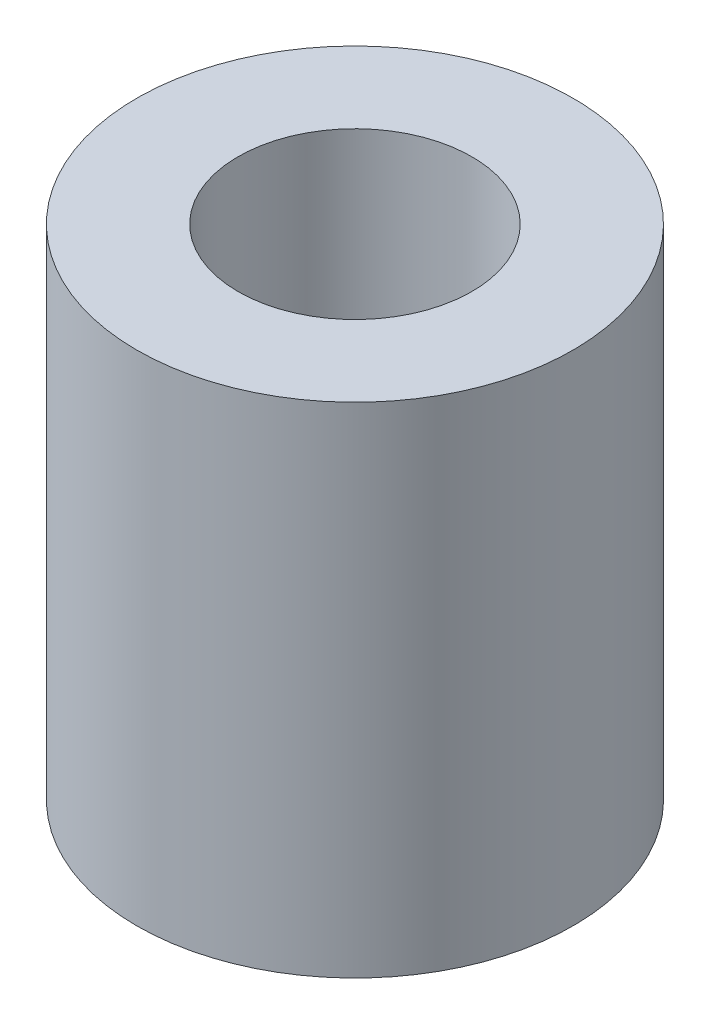
ISO-10303-21;
HEADER;
FILE_DESCRIPTION(('STEP AP214'),'2;1');
FILE_NAME('part.step','',(''),(''),'','','');
FILE_SCHEMA(('AUTOMOTIVE_DESIGN { 1 0 10303 214 1 1 1 1 }'));
ENDSEC;
DATA;
#1=APPLICATION_CONTEXT('core data for automotive mechanical design processes');
#2=APPLICATION_PROTOCOL_DEFINITION('international standard','automotive_design',2000,#1);
#3=PRODUCT_CONTEXT('',#1,'mechanical');
#4=PRODUCT('Part','Part','',(#3));
#5=PRODUCT_RELATED_PRODUCT_CATEGORY('part','',(#4));
#6=PRODUCT_DEFINITION_FORMATION('','',#4);
#7=PRODUCT_DEFINITION_CONTEXT('part definition',#1,'design');
#8=PRODUCT_DEFINITION('design','',#6,#7);
#9=PRODUCT_DEFINITION_SHAPE('','',#8);
#10=(LENGTH_UNIT() NAMED_UNIT(*) SI_UNIT(.MILLI.,.METRE.));
#11=(NAMED_UNIT(*) PLANE_ANGLE_UNIT() SI_UNIT($,.RADIAN.));
#12=(NAMED_UNIT(*) SI_UNIT($,.STERADIAN.) SOLID_ANGLE_UNIT());
#13=UNCERTAINTY_MEASURE_WITH_UNIT(LENGTH_MEASURE(1.E-05),#10,'distance_accuracy_value','');
#14=(GEOMETRIC_REPRESENTATION_CONTEXT(3) GLOBAL_UNCERTAINTY_ASSIGNED_CONTEXT((#13)) GLOBAL_UNIT_ASSIGNED_CONTEXT((#10,
#11,#12)) REPRESENTATION_CONTEXT('',''));
#15=CARTESIAN_POINT('',(0.,0.,0.));
#16=DIRECTION('',(0.,0.,1.));
#17=DIRECTION('',(1.,0.,0.));
#18=AXIS2_PLACEMENT_3D('',#15,#16,#17);
#19=CARTESIAN_POINT('',(0.,8.,0.));
#20=DIRECTION('',(0.,1.,0.));
#21=DIRECTION('',(0.,0.,1.));
#22=AXIS2_PLACEMENT_3D('',#19,#20,#21);
#23=PLANE('',#22);
#24=CARTESIAN_POINT('',(0.,8.,0.));
#25=DIRECTION('',(0.,1.,0.));
#26=DIRECTION('',(0.,0.,1.));
#27=AXIS2_PLACEMENT_3D('',#24,#25,#26);
#28=CIRCLE('',#27,3.5);
#29=CARTESIAN_POINT('',(0.,8.,3.5));
#30=VERTEX_POINT('',#29);
#31=EDGE_CURVE('E10',#30,#30,#28,.T.);
#32=ORIENTED_EDGE('',*,*,#31,.T.);
#33=EDGE_LOOP('',(#32));
#34=FACE_BOUND('',#33,.T.);
#35=CARTESIAN_POINT('',(0.,8.,0.));
#36=DIRECTION('',(0.,1.,0.));
#37=DIRECTION('',(0.,0.,1.));
#38=AXIS2_PLACEMENT_3D('',#35,#36,#37);
#39=CIRCLE('',#38,1.875);
#40=CARTESIAN_POINT('',(0.,8.,1.875));
#41=VERTEX_POINT('',#40);
#42=EDGE_CURVE('E44',#41,#41,#39,.T.);
#43=ORIENTED_EDGE('',*,*,#42,.F.);
#44=EDGE_LOOP('',(#43));
#45=FACE_BOUND('',#44,.T.);
#46=ADVANCED_FACE('F33',(#34,#45),#23,.T.);
#47=CARTESIAN_POINT('',(0.,0.,0.));
#48=DIRECTION('',(0.,1.,0.));
#49=DIRECTION('',(0.,0.,1.));
#50=AXIS2_PLACEMENT_3D('',#47,#48,#49);
#51=PLANE('',#50);
#52=CARTESIAN_POINT('',(0.,0.,0.));
#53=DIRECTION('',(0.,1.,0.));
#54=DIRECTION('',(0.,0.,1.));
#55=AXIS2_PLACEMENT_3D('',#52,#53,#54);
#56=CIRCLE('',#55,3.5);
#57=CARTESIAN_POINT('',(0.,0.,3.5));
#58=VERTEX_POINT('',#57);
#59=EDGE_CURVE('E37',#58,#58,#56,.T.);
#60=ORIENTED_EDGE('',*,*,#59,.F.);
#61=EDGE_LOOP('',(#60));
#62=FACE_BOUND('',#61,.T.);
#63=CARTESIAN_POINT('',(0.,0.,0.));
#64=DIRECTION('',(0.,1.,0.));
#65=DIRECTION('',(0.,0.,1.));
#66=AXIS2_PLACEMENT_3D('',#63,#64,#65);
#67=CIRCLE('',#66,1.875);
#68=CARTESIAN_POINT('',(0.,0.,1.875));
#69=VERTEX_POINT('',#68);
#70=EDGE_CURVE('E46',#69,#69,#67,.T.);
#71=ORIENTED_EDGE('',*,*,#70,.T.);
#72=EDGE_LOOP('',(#71));
#73=FACE_BOUND('',#72,.T.);
#74=ADVANCED_FACE('F56',(#62,#73),#51,.F.);
#75=CARTESIAN_POINT('',(0.,8.,0.));
#76=DIRECTION('',(0.,-1.,0.));
#77=DIRECTION('',(0.,0.,-1.));
#78=AXIS2_PLACEMENT_3D('',#75,#76,#77);
#79=CYLINDRICAL_SURFACE('',#78,3.5);
#80=ORIENTED_EDGE('',*,*,#31,.F.);
#81=EDGE_LOOP('',(#80));
#82=FACE_BOUND('',#81,.T.);
#83=ORIENTED_EDGE('',*,*,#59,.T.);
#84=EDGE_LOOP('',(#83));
#85=FACE_BOUND('',#84,.T.);
#86=ADVANCED_FACE('F35',(#82,#85),#79,.T.);
#87=CARTESIAN_POINT('',(0.,8.,0.));
#88=DIRECTION('',(0.,-1.,0.));
#89=DIRECTION('',(0.,0.,-1.));
#90=AXIS2_PLACEMENT_3D('',#87,#88,#89);
#91=CYLINDRICAL_SURFACE('',#90,1.875);
#92=ORIENTED_EDGE('',*,*,#42,.T.);
#93=EDGE_LOOP('',(#92));
#94=FACE_BOUND('',#93,.T.);
#95=ORIENTED_EDGE('',*,*,#70,.F.);
#96=EDGE_LOOP('',(#95));
#97=FACE_BOUND('',#96,.T.);
#98=ADVANCED_FACE('F52',(#94,#97),#91,.F.);
#99=CLOSED_SHELL('',(#46,#74,#86,#98));
#100=MANIFOLD_SOLID_BREP('B2',#99);
#101=ADVANCED_BREP_SHAPE_REPRESENTATION('',(#18,#100),#14);
#102=SHAPE_DEFINITION_REPRESENTATION(#9,#101);
ENDSEC;
END-ISO-10303-21;
